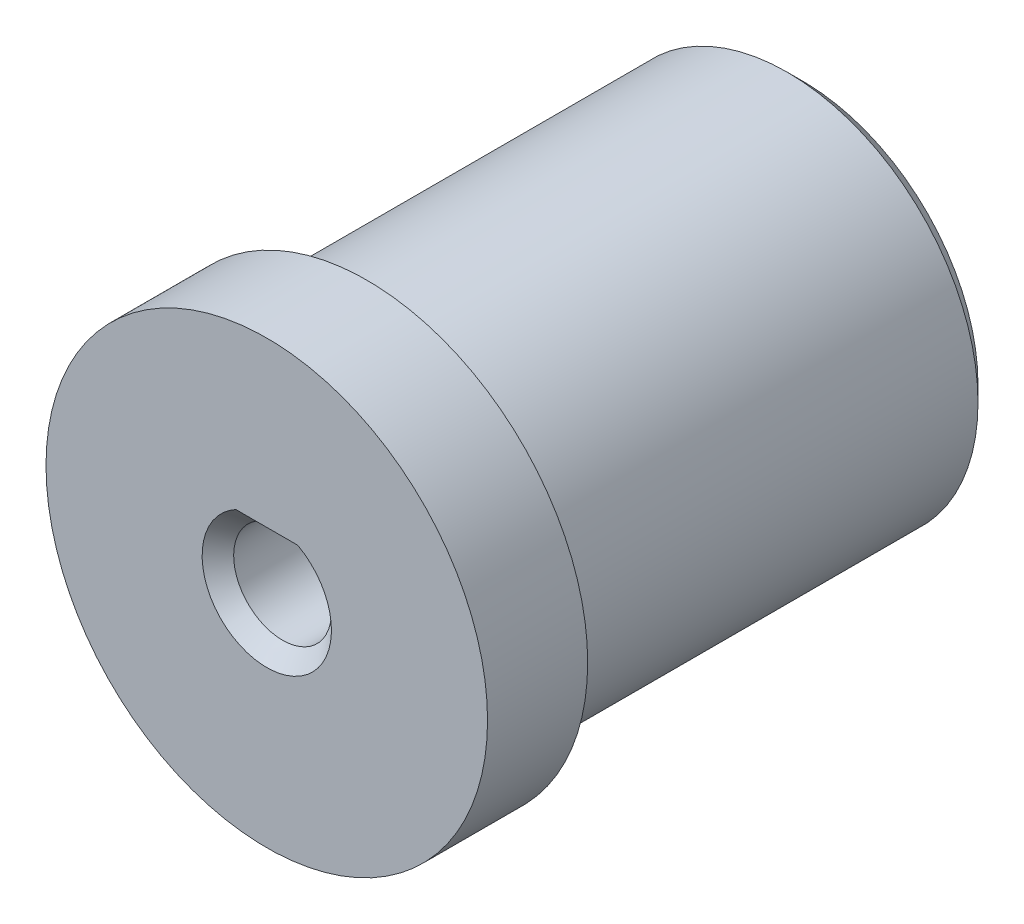
ISO-10303-21;
HEADER;
FILE_DESCRIPTION(('STEP AP214'),'2;1');
FILE_NAME('part.step','',(''),(''),'','','');
FILE_SCHEMA(('AUTOMOTIVE_DESIGN { 1 0 10303 214 1 1 1 1 }'));
ENDSEC;
DATA;
#1=APPLICATION_CONTEXT('core data for automotive mechanical design processes');
#2=APPLICATION_PROTOCOL_DEFINITION('international standard','automotive_design',2000,#1);
#3=PRODUCT_CONTEXT('',#1,'mechanical');
#4=PRODUCT('Part','Part','',(#3));
#5=PRODUCT_RELATED_PRODUCT_CATEGORY('part','',(#4));
#6=PRODUCT_DEFINITION_FORMATION('','',#4);
#7=PRODUCT_DEFINITION_CONTEXT('part definition',#1,'design');
#8=PRODUCT_DEFINITION('design','',#6,#7);
#9=PRODUCT_DEFINITION_SHAPE('','',#8);
#10=(LENGTH_UNIT() NAMED_UNIT(*) SI_UNIT(.MILLI.,.METRE.));
#11=(NAMED_UNIT(*) PLANE_ANGLE_UNIT() SI_UNIT($,.RADIAN.));
#12=(NAMED_UNIT(*) SI_UNIT($,.STERADIAN.) SOLID_ANGLE_UNIT());
#13=UNCERTAINTY_MEASURE_WITH_UNIT(LENGTH_MEASURE(1.E-05),#10,'distance_accuracy_value','');
#14=(GEOMETRIC_REPRESENTATION_CONTEXT(3) GLOBAL_UNCERTAINTY_ASSIGNED_CONTEXT((#13)) GLOBAL_UNIT_ASSIGNED_CONTEXT((#10,
#11,#12)) REPRESENTATION_CONTEXT('',''));
#15=CARTESIAN_POINT('',(0.,0.,0.));
#16=DIRECTION('',(0.,0.,1.));
#17=DIRECTION('',(1.,0.,0.));
#18=AXIS2_PLACEMENT_3D('',#15,#16,#17);
#19=CARTESIAN_POINT('',(0.,0.,34.));
#20=DIRECTION('',(0.,0.,-1.));
#21=DIRECTION('',(-1.,0.,0.));
#22=AXIS2_PLACEMENT_3D('',#19,#20,#21);
#23=CYLINDRICAL_SURFACE('',#22,12.1);
#24=CARTESIAN_POINT('',(0.,0.,1.));
#25=DIRECTION('',(0.,0.,1.));
#26=DIRECTION('',(1.,0.,0.));
#27=AXIS2_PLACEMENT_3D('',#24,#25,#26);
#28=CIRCLE('',#27,12.1);
#29=CARTESIAN_POINT('',(12.1,0.,1.));
#30=VERTEX_POINT('',#29);
#31=EDGE_CURVE('E120',#30,#30,#28,.T.);
#32=ORIENTED_EDGE('',*,*,#31,.T.);
#33=EDGE_LOOP('',(#32));
#34=FACE_BOUND('',#33,.T.);
#35=CARTESIAN_POINT('',(0.,0.,27.65));
#36=DIRECTION('',(0.,0.,1.));
#37=DIRECTION('',(1.,0.,0.));
#38=AXIS2_PLACEMENT_3D('',#35,#36,#37);
#39=CIRCLE('',#38,12.1);
#40=CARTESIAN_POINT('',(12.1,0.,27.65));
#41=VERTEX_POINT('',#40);
#42=EDGE_CURVE('E107',#41,#41,#39,.T.);
#43=ORIENTED_EDGE('',*,*,#42,.F.);
#44=EDGE_LOOP('',(#43));
#45=FACE_BOUND('',#44,.T.);
#46=ADVANCED_FACE('F47',(#34,#45),#23,.T.);
#47=CARTESIAN_POINT('',(0.,0.,34.));
#48=DIRECTION('',(0.,0.,-1.));
#49=DIRECTION('',(-1.,0.,0.));
#50=AXIS2_PLACEMENT_3D('',#47,#48,#49);
#51=CYLINDRICAL_SURFACE('',#50,3.1);
#52=DIRECTION('',(0.,0.,-1.));
#53=VECTOR('',#52,1.);
#54=CARTESIAN_POINT('',(1.68819430161341,2.6,34.));
#55=LINE('',#54,#53);
#56=CARTESIAN_POINT('',(1.68819430161341,2.6,33.));
#57=VERTEX_POINT('',#56);
#58=CARTESIAN_POINT('',(1.68819430161341,2.6,1.));
#59=VERTEX_POINT('',#58);
#60=EDGE_CURVE('E102',#57,#59,#55,.T.);
#61=ORIENTED_EDGE('',*,*,#60,.T.);
#62=CARTESIAN_POINT('',(0.,0.,1.));
#63=DIRECTION('',(0.,0.,1.));
#64=DIRECTION('',(1.,0.,0.));
#65=AXIS2_PLACEMENT_3D('',#62,#63,#64);
#66=CIRCLE('',#65,3.1);
#67=CARTESIAN_POINT('',(-1.68819430161341,2.6,1.));
#68=VERTEX_POINT('',#67);
#69=EDGE_CURVE('E113',#59,#68,#66,.F.);
#70=ORIENTED_EDGE('',*,*,#69,.T.);
#71=DIRECTION('',(0.,0.,-1.));
#72=VECTOR('',#71,1.);
#73=CARTESIAN_POINT('',(-1.68819430161341,2.6,34.));
#74=LINE('',#73,#72);
#75=CARTESIAN_POINT('',(-1.68819430161341,2.6,33.));
#76=VERTEX_POINT('',#75);
#77=EDGE_CURVE('E99',#76,#68,#74,.T.);
#78=ORIENTED_EDGE('',*,*,#77,.F.);
#79=CARTESIAN_POINT('',(0.,0.,33.));
#80=DIRECTION('',(0.,0.,1.));
#81=DIRECTION('',(1.,0.,0.));
#82=AXIS2_PLACEMENT_3D('',#79,#80,#81);
#83=CIRCLE('',#82,3.1);
#84=EDGE_CURVE('E111',#76,#57,#83,.T.);
#85=ORIENTED_EDGE('',*,*,#84,.T.);
#86=EDGE_LOOP('',(#61,#70,#78,#85));
#87=FACE_BOUND('',#86,.T.);
#88=ADVANCED_FACE('F110',(#87),#51,.F.);
#89=CARTESIAN_POINT('',(0.,2.6,34.));
#90=DIRECTION('',(0.,1.,0.));
#91=DIRECTION('',(0.,0.,1.));
#92=AXIS2_PLACEMENT_3D('',#89,#90,#91);
#93=PLANE('',#92);
#94=ORIENTED_EDGE('',*,*,#77,.T.);
#95=DIRECTION('',(1.,0.,0.));
#96=VECTOR('',#95,1.);
#97=CARTESIAN_POINT('',(0.,2.6,1.));
#98=LINE('',#97,#96);
#99=EDGE_CURVE('E106',#68,#59,#98,.T.);
#100=ORIENTED_EDGE('',*,*,#99,.T.);
#101=ORIENTED_EDGE('',*,*,#60,.F.);
#102=DIRECTION('',(-1.,0.,0.));
#103=VECTOR('',#102,1.);
#104=CARTESIAN_POINT('',(-1.68819430161341,2.6,33.));
#105=LINE('',#104,#103);
#106=EDGE_CURVE('E95',#57,#76,#105,.T.);
#107=ORIENTED_EDGE('',*,*,#106,.T.);
#108=EDGE_LOOP('',(#94,#100,#101,#107));
#109=FACE_BOUND('',#108,.T.);
#110=ADVANCED_FACE('F97',(#109),#93,.F.);
#111=CARTESIAN_POINT('',(0.,0.,34.));
#112=DIRECTION('',(0.,0.,1.));
#113=DIRECTION('',(1.,0.,0.));
#114=AXIS2_PLACEMENT_3D('',#111,#112,#113);
#115=PLANE('',#114);
#116=DIRECTION('',(1.,0.,0.));
#117=VECTOR('',#116,1.);
#118=CARTESIAN_POINT('',(1.68819430161341,3.60000000000001,34.));
#119=LINE('',#118,#117);
#120=CARTESIAN_POINT('',(-1.96214168703486,3.60000000000001,34.));
#121=VERTEX_POINT('',#120);
#122=CARTESIAN_POINT('',(1.96214168703486,3.60000000000001,34.));
#123=VERTEX_POINT('',#122);
#124=EDGE_CURVE('E62',#121,#123,#119,.T.);
#125=ORIENTED_EDGE('',*,*,#124,.T.);
#126=CARTESIAN_POINT('',(0.,0.,34.));
#127=DIRECTION('',(0.,0.,1.));
#128=DIRECTION('',(1.,0.,0.));
#129=AXIS2_PLACEMENT_3D('',#126,#127,#128);
#130=CIRCLE('',#129,4.10000000000001);
#131=EDGE_CURVE('E11',#123,#121,#130,.F.);
#132=ORIENTED_EDGE('',*,*,#131,.T.);
#133=EDGE_LOOP('',(#125,#132));
#134=FACE_BOUND('',#133,.T.);
#135=CARTESIAN_POINT('',(0.,0.,34.));
#136=DIRECTION('',(0.,0.,1.));
#137=DIRECTION('',(1.,0.,0.));
#138=AXIS2_PLACEMENT_3D('',#135,#136,#137);
#139=CIRCLE('',#138,14.);
#140=CARTESIAN_POINT('',(14.,0.,34.));
#141=VERTEX_POINT('',#140);
#142=EDGE_CURVE('E211',#141,#141,#139,.T.);
#143=ORIENTED_EDGE('',*,*,#142,.T.);
#144=EDGE_LOOP('',(#143));
#145=FACE_BOUND('',#144,.T.);
#146=ADVANCED_FACE('F188',(#134,#145),#115,.T.);
#147=CARTESIAN_POINT('',(0.,0.,0.));
#148=DIRECTION('',(0.,0.,1.));
#149=DIRECTION('',(1.,0.,0.));
#150=AXIS2_PLACEMENT_3D('',#147,#148,#149);
#151=PLANE('',#150);
#152=CARTESIAN_POINT('',(0.,0.,0.));
#153=DIRECTION('',(0.,0.,1.));
#154=DIRECTION('',(1.,0.,0.));
#155=AXIS2_PLACEMENT_3D('',#152,#153,#154);
#156=CIRCLE('',#155,4.1);
#157=CARTESIAN_POINT('',(-1.96214168703486,3.6,0.));
#158=VERTEX_POINT('',#157);
#159=CARTESIAN_POINT('',(1.96214168703486,3.6,0.));
#160=VERTEX_POINT('',#159);
#161=EDGE_CURVE('E123',#158,#160,#156,.T.);
#162=ORIENTED_EDGE('',*,*,#161,.T.);
#163=DIRECTION('',(-1.,0.,0.));
#164=VECTOR('',#163,1.);
#165=CARTESIAN_POINT('',(0.,3.6,0.));
#166=LINE('',#165,#164);
#167=EDGE_CURVE('E118',#160,#158,#166,.T.);
#168=ORIENTED_EDGE('',*,*,#167,.T.);
#169=EDGE_LOOP('',(#162,#168));
#170=FACE_BOUND('',#169,.T.);
#171=CARTESIAN_POINT('',(0.,0.,0.));
#172=DIRECTION('',(0.,0.,1.));
#173=DIRECTION('',(1.,0.,0.));
#174=AXIS2_PLACEMENT_3D('',#171,#172,#173);
#175=CIRCLE('',#174,11.1);
#176=CARTESIAN_POINT('',(11.1,0.,0.));
#177=VERTEX_POINT('',#176);
#178=EDGE_CURVE('E219',#177,#177,#175,.F.);
#179=ORIENTED_EDGE('',*,*,#178,.T.);
#180=EDGE_LOOP('',(#179));
#181=FACE_BOUND('',#180,.T.);
#182=ADVANCED_FACE('F185',(#170,#181),#151,.F.);
#183=CARTESIAN_POINT('',(0.,0.,27.65));
#184=DIRECTION('',(0.,0.,1.));
#185=DIRECTION('',(1.,0.,0.));
#186=AXIS2_PLACEMENT_3D('',#183,#184,#185);
#187=CYLINDRICAL_SURFACE('',#186,14.);
#188=CARTESIAN_POINT('',(0.,0.,27.65));
#189=DIRECTION('',(0.,0.,1.));
#190=DIRECTION('',(1.,0.,0.));
#191=AXIS2_PLACEMENT_3D('',#188,#189,#190);
#192=CIRCLE('',#191,14.);
#193=CARTESIAN_POINT('',(14.,0.,27.65));
#194=VERTEX_POINT('',#193);
#195=EDGE_CURVE('E210',#194,#194,#192,.T.);
#196=ORIENTED_EDGE('',*,*,#195,.T.);
#197=EDGE_LOOP('',(#196));
#198=FACE_BOUND('',#197,.T.);
#199=ORIENTED_EDGE('',*,*,#142,.F.);
#200=EDGE_LOOP('',(#199));
#201=FACE_BOUND('',#200,.T.);
#202=ADVANCED_FACE('F195',(#198,#201),#187,.T.);
#203=CARTESIAN_POINT('',(0.,0.,27.65));
#204=DIRECTION('',(0.,0.,1.));
#205=DIRECTION('',(1.,0.,0.));
#206=AXIS2_PLACEMENT_3D('',#203,#204,#205);
#207=PLANE('',#206);
#208=ORIENTED_EDGE('',*,*,#42,.T.);
#209=EDGE_LOOP('',(#208));
#210=FACE_BOUND('',#209,.T.);
#211=ORIENTED_EDGE('',*,*,#195,.F.);
#212=EDGE_LOOP('',(#211));
#213=FACE_BOUND('',#212,.T.);
#214=ADVANCED_FACE('F153',(#210,#213),#207,.F.);
#215=CARTESIAN_POINT('',(0.,0.,0.));
#216=DIRECTION('',(0.,0.,-1.));
#217=DIRECTION('',(-1.,0.,0.));
#218=AXIS2_PLACEMENT_3D('',#215,#216,#217);
#219=CONICAL_SURFACE('',#218,4.1,0.785398163397448);
#220=CARTESIAN_POINT('',(1.68819430161341,2.6,1.));
#221=CARTESIAN_POINT('',(1.71279866733105,2.68308638535051,0.916913614649487));
#222=CARTESIAN_POINT('',(1.73689462579406,2.76624740754017,0.833752592459827));
#223=CARTESIAN_POINT('',(1.78416858408236,2.93269565658889,0.66730434341111));
#224=CARTESIAN_POINT('',(1.80734662890343,3.01598287705344,0.584017122946563));
#225=CARTESIAN_POINT('',(1.85288564095706,3.18266725754806,0.417332742451942));
#226=CARTESIAN_POINT('',(1.8752466214741,3.26606441576782,0.333935584232185));
#227=CARTESIAN_POINT('',(1.9192295785975,3.43296040077836,0.167039599221638));
#228=CARTESIAN_POINT('',(1.94085151892459,3.51645923235249,0.083540767647511));
#229=CARTESIAN_POINT('',(1.96214168703486,3.6,0.));
#230=B_SPLINE_CURVE_WITH_KNOTS('',3,(#220,#221,#222,#223,#224,#225,#226,#227,#228,#229),
.UNSPECIFIED.,.F.,.F.,(4,2,2,2,4),(0.,0.360148438946225,0.720279201644094,1.08040410644696,
1.44054666436265),.UNSPECIFIED.);
#231=EDGE_CURVE('E115',#160,#59,#230,.F.);
#232=ORIENTED_EDGE('',*,*,#231,.F.);
#233=ORIENTED_EDGE('',*,*,#161,.F.);
#234=CARTESIAN_POINT('',(-1.96214168703486,3.6,0.));
#235=CARTESIAN_POINT('',(-1.94085151892459,3.51645923235249,0.0835407676475108));
#236=CARTESIAN_POINT('',(-1.9192295785975,3.43296040077836,0.167039599221638));
#237=CARTESIAN_POINT('',(-1.8752466214741,3.26606441576782,0.333935584232185));
#238=CARTESIAN_POINT('',(-1.85288564095706,3.18266725754806,0.417332742451942));
#239=CARTESIAN_POINT('',(-1.80734662890343,3.01598287705344,0.584017122946563));
#240=CARTESIAN_POINT('',(-1.78416858408236,2.93269565658889,0.66730434341111));
#241=CARTESIAN_POINT('',(-1.73689462579406,2.76624740754017,0.833752592459827));
#242=CARTESIAN_POINT('',(-1.71279866733105,2.68308638535051,0.916913614649487));
#243=CARTESIAN_POINT('',(-1.68819430161341,2.6,1.));
#244=B_SPLINE_CURVE_WITH_KNOTS('',3,(#234,#235,#236,#237,#238,#239,#240,#241,#242,#243),
.UNSPECIFIED.,.F.,.F.,(4,2,2,2,4),(0.,0.360142557915695,0.72026746271856,1.08039822541643,
1.44054666436265),.UNSPECIFIED.);
#245=EDGE_CURVE('E137',#68,#158,#244,.F.);
#246=ORIENTED_EDGE('',*,*,#245,.F.);
#247=ORIENTED_EDGE('',*,*,#69,.F.);
#248=EDGE_LOOP('',(#232,#233,#246,#247));
#249=FACE_BOUND('',#248,.T.);
#250=ADVANCED_FACE('F147',(#249),#219,.F.);
#251=CARTESIAN_POINT('',(0.,2.6,1.));
#252=DIRECTION('',(0.,0.707106781186548,0.707106781186547));
#253=DIRECTION('',(1.,0.,0.));
#254=AXIS2_PLACEMENT_3D('',#251,#252,#253);
#255=PLANE('',#254);
#256=ORIENTED_EDGE('',*,*,#245,.T.);
#257=ORIENTED_EDGE('',*,*,#167,.F.);
#258=ORIENTED_EDGE('',*,*,#231,.T.);
#259=ORIENTED_EDGE('',*,*,#99,.F.);
#260=EDGE_LOOP('',(#256,#257,#258,#259));
#261=FACE_BOUND('',#260,.T.);
#262=ADVANCED_FACE('F143',(#261),#255,.F.);
#263=CARTESIAN_POINT('',(0.,0.,1.));
#264=DIRECTION('',(0.,0.,1.));
#265=DIRECTION('',(1.,0.,0.));
#266=AXIS2_PLACEMENT_3D('',#263,#264,#265);
#267=CONICAL_SURFACE('',#266,12.1,0.785398163397449);
#268=ORIENTED_EDGE('',*,*,#178,.F.);
#269=EDGE_LOOP('',(#268));
#270=FACE_BOUND('',#269,.T.);
#271=ORIENTED_EDGE('',*,*,#31,.F.);
#272=EDGE_LOOP('',(#271));
#273=FACE_BOUND('',#272,.T.);
#274=ADVANCED_FACE('F156',(#270,#273),#267,.T.);
#275=CARTESIAN_POINT('',(0.,3.60000000000001,34.));
#276=DIRECTION('',(0.,-0.70710678118655,0.707106781186545));
#277=DIRECTION('',(-1.,0.,0.));
#278=AXIS2_PLACEMENT_3D('',#275,#276,#277);
#279=PLANE('',#278);
#280=CARTESIAN_POINT('',(1.68819430161341,2.6,33.));
#281=CARTESIAN_POINT('',(1.71279866733105,2.68308638535052,33.0830863853505));
#282=CARTESIAN_POINT('',(1.73689462579407,2.76624740754018,33.1662474075402));
#283=CARTESIAN_POINT('',(1.78416858408236,2.93269565658889,33.3326956565889));
#284=CARTESIAN_POINT('',(1.80734662890343,3.01598287705344,33.4159828770534));
#285=CARTESIAN_POINT('',(1.85288564095706,3.18266725754806,33.5826672575481));
#286=CARTESIAN_POINT('',(1.8752466214741,3.26606441576782,33.6660644157678));
#287=CARTESIAN_POINT('',(1.9192295785975,3.43296040077837,33.8329604007784));
#288=CARTESIAN_POINT('',(1.9408515189246,3.5164592323525,33.9164592323525));
#289=CARTESIAN_POINT('',(1.96214168703486,3.60000000000001,34.));
#290=B_SPLINE_CURVE_WITH_KNOTS('',3,(#280,#281,#282,#283,#284,#285,#286,#287,#288,#289),
.UNSPECIFIED.,.F.,.F.,(4,2,2,2,4),(0.,0.360148438946226,0.720279201644104,1.08040410644697,
1.44054666436267),.UNSPECIFIED.);
#291=EDGE_CURVE('E116',#123,#57,#290,.F.);
#292=ORIENTED_EDGE('',*,*,#291,.F.);
#293=ORIENTED_EDGE('',*,*,#124,.F.);
#294=CARTESIAN_POINT('',(-1.96214168703486,3.60000000000001,34.));
#295=CARTESIAN_POINT('',(-1.9408515189246,3.5164592323525,33.9164592323525));
#296=CARTESIAN_POINT('',(-1.9192295785975,3.43296040077837,33.8329604007784));
#297=CARTESIAN_POINT('',(-1.8752466214741,3.26606441576782,33.6660644157678));
#298=CARTESIAN_POINT('',(-1.85288564095706,3.18266725754806,33.5826672575481));
#299=CARTESIAN_POINT('',(-1.80734662890343,3.01598287705344,33.4159828770534));
#300=CARTESIAN_POINT('',(-1.78416858408236,2.93269565658889,33.3326956565889));
#301=CARTESIAN_POINT('',(-1.73689462579406,2.76624740754018,33.1662474075402));
#302=CARTESIAN_POINT('',(-1.71279866733105,2.68308638535052,33.0830863853505));
#303=CARTESIAN_POINT('',(-1.68819430161341,2.6,33.));
#304=B_SPLINE_CURVE_WITH_KNOTS('',3,(#294,#295,#296,#297,#298,#299,#300,#301,#302,#303),
.UNSPECIFIED.,.F.,.F.,(4,2,2,2,4),(0.,0.360142557915701,0.720267462718567,1.08039822541645,
1.44054666436267),.UNSPECIFIED.);
#305=EDGE_CURVE('E53',#76,#121,#304,.F.);
#306=ORIENTED_EDGE('',*,*,#305,.F.);
#307=ORIENTED_EDGE('',*,*,#106,.F.);
#308=EDGE_LOOP('',(#292,#293,#306,#307));
#309=FACE_BOUND('',#308,.T.);
#310=ADVANCED_FACE('F50',(#309),#279,.T.);
#311=CARTESIAN_POINT('',(0.,0.,33.));
#312=DIRECTION('',(0.,0.,1.));
#313=DIRECTION('',(1.,0.,0.));
#314=AXIS2_PLACEMENT_3D('',#311,#312,#313);
#315=CONICAL_SURFACE('',#314,3.1,0.785398163397445);
#316=ORIENTED_EDGE('',*,*,#305,.T.);
#317=ORIENTED_EDGE('',*,*,#131,.F.);
#318=ORIENTED_EDGE('',*,*,#291,.T.);
#319=ORIENTED_EDGE('',*,*,#84,.F.);
#320=EDGE_LOOP('',(#316,#317,#318,#319));
#321=FACE_BOUND('',#320,.T.);
#322=ADVANCED_FACE('F117',(#321),#315,.F.);
#323=CLOSED_SHELL('',(#46,#88,#110,#146,#182,#202,#214,#250,#262,#274,#310,#322));
#324=MANIFOLD_SOLID_BREP('B2',#323);
#325=ADVANCED_BREP_SHAPE_REPRESENTATION('',(#18,#324),#14);
#326=SHAPE_DEFINITION_REPRESENTATION(#9,#325);
ENDSEC;
END-ISO-10303-21;
